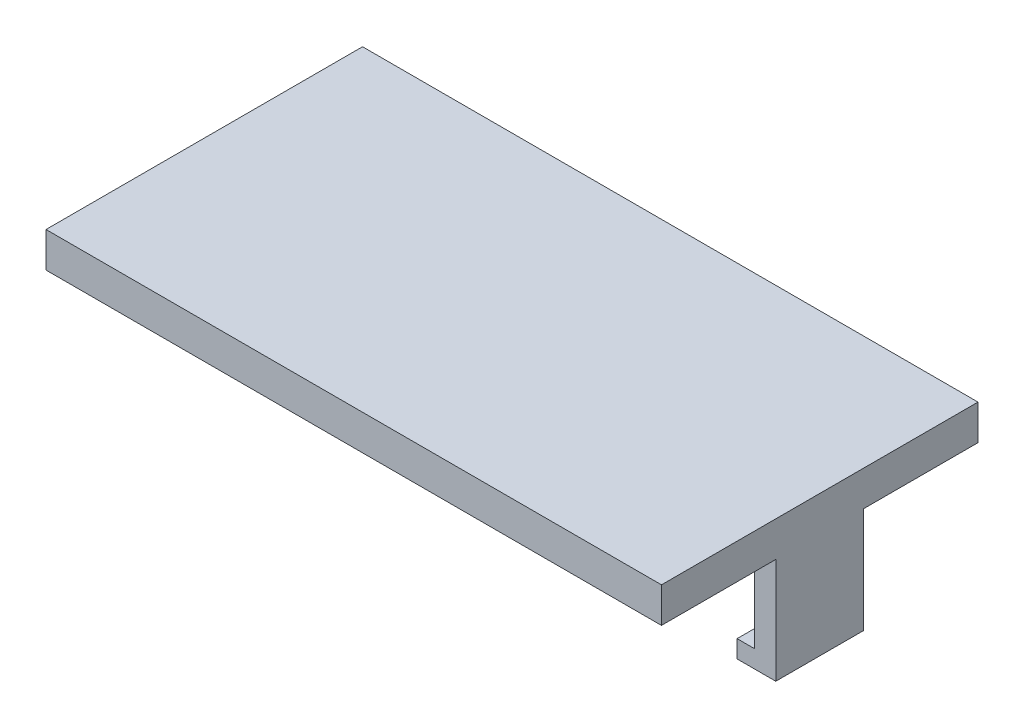
ISO-10303-21;
HEADER;
FILE_DESCRIPTION(('STEP AP214'),'2;1');
FILE_NAME('part.step','',(''),(''),'','','');
FILE_SCHEMA(('AUTOMOTIVE_DESIGN { 1 0 10303 214 1 1 1 1 }'));
ENDSEC;
DATA;
#1=APPLICATION_CONTEXT('core data for automotive mechanical design processes');
#2=APPLICATION_PROTOCOL_DEFINITION('international standard','automotive_design',2000,#1);
#3=PRODUCT_CONTEXT('',#1,'mechanical');
#4=PRODUCT('Part','Part','',(#3));
#5=PRODUCT_RELATED_PRODUCT_CATEGORY('part','',(#4));
#6=PRODUCT_DEFINITION_FORMATION('','',#4);
#7=PRODUCT_DEFINITION_CONTEXT('part definition',#1,'design');
#8=PRODUCT_DEFINITION('design','',#6,#7);
#9=PRODUCT_DEFINITION_SHAPE('','',#8);
#10=(LENGTH_UNIT() NAMED_UNIT(*) SI_UNIT(.MILLI.,.METRE.));
#11=(NAMED_UNIT(*) PLANE_ANGLE_UNIT() SI_UNIT($,.RADIAN.));
#12=(NAMED_UNIT(*) SI_UNIT($,.STERADIAN.) SOLID_ANGLE_UNIT());
#13=UNCERTAINTY_MEASURE_WITH_UNIT(LENGTH_MEASURE(1.E-05),#10,'distance_accuracy_value','');
#14=(GEOMETRIC_REPRESENTATION_CONTEXT(3) GLOBAL_UNCERTAINTY_ASSIGNED_CONTEXT((#13)) GLOBAL_UNIT_ASSIGNED_CONTEXT((#10,
#11,#12)) REPRESENTATION_CONTEXT('',''));
#15=CARTESIAN_POINT('',(0.,0.,0.));
#16=DIRECTION('',(0.,0.,1.));
#17=DIRECTION('',(1.,0.,0.));
#18=AXIS2_PLACEMENT_3D('',#15,#16,#17);
#19=CARTESIAN_POINT('',(16.3,0.,0.));
#20=DIRECTION('',(1.,0.,0.));
#21=DIRECTION('',(0.,0.,-1.));
#22=AXIS2_PLACEMENT_3D('',#19,#20,#21);
#23=PLANE('',#22);
#24=DIRECTION('',(0.,0.,-1.));
#25=VECTOR('',#24,1.);
#26=CARTESIAN_POINT('',(16.3,-5.,-2.5));
#27=LINE('',#26,#25);
#28=CARTESIAN_POINT('',(16.3,-5.,2.5));
#29=VERTEX_POINT('',#28);
#30=CARTESIAN_POINT('',(16.3,-5.,-2.5));
#31=VERTEX_POINT('',#30);
#32=EDGE_CURVE('E211',#29,#31,#27,.T.);
#33=ORIENTED_EDGE('',*,*,#32,.F.);
#34=DIRECTION('',(0.,-1.,0.));
#35=VECTOR('',#34,1.);
#36=CARTESIAN_POINT('',(16.3,0.,2.5));
#37=LINE('',#36,#35);
#38=CARTESIAN_POINT('',(16.3,0.,2.5));
#39=VERTEX_POINT('',#38);
#40=EDGE_CURVE('E259',#39,#29,#37,.T.);
#41=ORIENTED_EDGE('',*,*,#40,.F.);
#42=DIRECTION('',(0.,0.,1.));
#43=VECTOR('',#42,1.);
#44=CARTESIAN_POINT('',(16.3,0.,2.5));
#45=LINE('',#44,#43);
#46=CARTESIAN_POINT('',(16.3,0.,-2.5));
#47=VERTEX_POINT('',#46);
#48=EDGE_CURVE('E254',#47,#39,#45,.T.);
#49=ORIENTED_EDGE('',*,*,#48,.F.);
#50=DIRECTION('',(0.,1.,0.));
#51=VECTOR('',#50,1.);
#52=CARTESIAN_POINT('',(16.3,0.,-2.5));
#53=LINE('',#52,#51);
#54=EDGE_CURVE('E249',#31,#47,#53,.T.);
#55=ORIENTED_EDGE('',*,*,#54,.F.);
#56=EDGE_LOOP('',(#33,#41,#49,#55));
#57=FACE_BOUND('',#56,.T.);
#58=ADVANCED_FACE('F44',(#57),#23,.F.);
#59=CARTESIAN_POINT('',(17.5,2.,9.));
#60=DIRECTION('',(-1.,0.,0.));
#61=DIRECTION('',(0.,0.,1.));
#62=AXIS2_PLACEMENT_3D('',#59,#60,#61);
#63=PLANE('',#62);
#64=DIRECTION('',(0.,0.,-1.));
#65=VECTOR('',#64,1.);
#66=CARTESIAN_POINT('',(17.5,0.,9.));
#67=LINE('',#66,#65);
#68=CARTESIAN_POINT('',(17.5,0.,9.));
#69=VERTEX_POINT('',#68);
#70=CARTESIAN_POINT('',(17.5,0.,2.5));
#71=VERTEX_POINT('',#70);
#72=EDGE_CURVE('E301',#69,#71,#67,.T.);
#73=ORIENTED_EDGE('',*,*,#72,.T.);
#74=DIRECTION('',(0.,-1.,0.));
#75=VECTOR('',#74,1.);
#76=CARTESIAN_POINT('',(17.5,0.,2.5));
#77=LINE('',#76,#75);
#78=CARTESIAN_POINT('',(17.5,-6.,2.5));
#79=VERTEX_POINT('',#78);
#80=EDGE_CURVE('E268',#71,#79,#77,.T.);
#81=ORIENTED_EDGE('',*,*,#80,.T.);
#82=DIRECTION('',(0.,0.,-1.));
#83=VECTOR('',#82,1.);
#84=CARTESIAN_POINT('',(17.5,-6.,2.5));
#85=LINE('',#84,#83);
#86=CARTESIAN_POINT('',(17.5,-6.,-2.5));
#87=VERTEX_POINT('',#86);
#88=EDGE_CURVE('E251',#79,#87,#85,.T.);
#89=ORIENTED_EDGE('',*,*,#88,.T.);
#90=DIRECTION('',(0.,1.,0.));
#91=VECTOR('',#90,1.);
#92=CARTESIAN_POINT('',(17.5,0.,-2.5));
#93=LINE('',#92,#91);
#94=CARTESIAN_POINT('',(17.5,0.,-2.5));
#95=VERTEX_POINT('',#94);
#96=EDGE_CURVE('E248',#87,#95,#93,.T.);
#97=ORIENTED_EDGE('',*,*,#96,.T.);
#98=CARTESIAN_POINT('',(17.5,0.,-9.));
#99=VERTEX_POINT('',#98);
#100=EDGE_CURVE('E277',#95,#99,#67,.T.);
#101=ORIENTED_EDGE('',*,*,#100,.T.);
#102=DIRECTION('',(0.,-1.,0.));
#103=VECTOR('',#102,1.);
#104=CARTESIAN_POINT('',(17.5,2.,-9.));
#105=LINE('',#104,#103);
#106=CARTESIAN_POINT('',(17.5,2.,-9.));
#107=VERTEX_POINT('',#106);
#108=EDGE_CURVE('E11',#107,#99,#105,.T.);
#109=ORIENTED_EDGE('',*,*,#108,.F.);
#110=DIRECTION('',(0.,0.,-1.));
#111=VECTOR('',#110,1.);
#112=CARTESIAN_POINT('',(17.5,2.,9.));
#113=LINE('',#112,#111);
#114=CARTESIAN_POINT('',(17.5,2.,9.));
#115=VERTEX_POINT('',#114);
#116=EDGE_CURVE('E288',#115,#107,#113,.T.);
#117=ORIENTED_EDGE('',*,*,#116,.F.);
#118=DIRECTION('',(0.,-1.,0.));
#119=VECTOR('',#118,1.);
#120=CARTESIAN_POINT('',(17.5,2.,9.));
#121=LINE('',#120,#119);
#122=EDGE_CURVE('E297',#115,#69,#121,.T.);
#123=ORIENTED_EDGE('',*,*,#122,.T.);
#124=EDGE_LOOP('',(#73,#81,#89,#97,#101,#109,#117,#123));
#125=FACE_BOUND('',#124,.T.);
#126=ADVANCED_FACE('F50',(#125),#63,.F.);
#127=CARTESIAN_POINT('',(-17.5,2.,-9.));
#128=DIRECTION('',(0.,0.,1.));
#129=DIRECTION('',(1.,0.,0.));
#130=AXIS2_PLACEMENT_3D('',#127,#128,#129);
#131=PLANE('',#130);
#132=DIRECTION('',(-1.,0.,0.));
#133=VECTOR('',#132,1.);
#134=CARTESIAN_POINT('',(-17.5,0.,-9.));
#135=LINE('',#134,#133);
#136=CARTESIAN_POINT('',(-17.5,0.,-9.));
#137=VERTEX_POINT('',#136);
#138=EDGE_CURVE('E304',#99,#137,#135,.T.);
#139=ORIENTED_EDGE('',*,*,#138,.T.);
#140=DIRECTION('',(0.,-1.,0.));
#141=VECTOR('',#140,1.);
#142=CARTESIAN_POINT('',(-17.5,2.,-9.));
#143=LINE('',#142,#141);
#144=CARTESIAN_POINT('',(-17.5,2.,-9.));
#145=VERTEX_POINT('',#144);
#146=EDGE_CURVE('E53',#145,#137,#143,.T.);
#147=ORIENTED_EDGE('',*,*,#146,.F.);
#148=DIRECTION('',(-1.,0.,0.));
#149=VECTOR('',#148,1.);
#150=CARTESIAN_POINT('',(-17.5,2.,-9.));
#151=LINE('',#150,#149);
#152=EDGE_CURVE('E289',#107,#145,#151,.T.);
#153=ORIENTED_EDGE('',*,*,#152,.F.);
#154=ORIENTED_EDGE('',*,*,#108,.T.);
#155=EDGE_LOOP('',(#139,#147,#153,#154));
#156=FACE_BOUND('',#155,.T.);
#157=ADVANCED_FACE('F390',(#156),#131,.F.);
#158=CARTESIAN_POINT('',(-17.5,2.,9.));
#159=DIRECTION('',(1.,0.,0.));
#160=DIRECTION('',(0.,0.,-1.));
#161=AXIS2_PLACEMENT_3D('',#158,#159,#160);
#162=PLANE('',#161);
#163=DIRECTION('',(0.,0.,1.));
#164=VECTOR('',#163,1.);
#165=CARTESIAN_POINT('',(-17.5,0.,9.));
#166=LINE('',#165,#164);
#167=CARTESIAN_POINT('',(-17.5,0.,-2.5));
#168=VERTEX_POINT('',#167);
#169=EDGE_CURVE('E307',#137,#168,#166,.T.);
#170=ORIENTED_EDGE('',*,*,#169,.T.);
#171=DIRECTION('',(0.,1.,0.));
#172=VECTOR('',#171,1.);
#173=CARTESIAN_POINT('',(-17.5,0.,-2.5));
#174=LINE('',#173,#172);
#175=CARTESIAN_POINT('',(-17.5,-6.,-2.5));
#176=VERTEX_POINT('',#175);
#177=EDGE_CURVE('E164',#176,#168,#174,.T.);
#178=ORIENTED_EDGE('',*,*,#177,.F.);
#179=DIRECTION('',(0.,0.,-1.));
#180=VECTOR('',#179,1.);
#181=CARTESIAN_POINT('',(-17.5,-6.,2.5));
#182=LINE('',#181,#180);
#183=CARTESIAN_POINT('',(-17.5,-6.,2.5));
#184=VERTEX_POINT('',#183);
#185=EDGE_CURVE('E204',#184,#176,#182,.T.);
#186=ORIENTED_EDGE('',*,*,#185,.F.);
#187=DIRECTION('',(0.,-1.,0.));
#188=VECTOR('',#187,1.);
#189=CARTESIAN_POINT('',(-17.5,0.,2.5));
#190=LINE('',#189,#188);
#191=CARTESIAN_POINT('',(-17.5,0.,2.5));
#192=VERTEX_POINT('',#191);
#193=EDGE_CURVE('E193',#192,#184,#190,.T.);
#194=ORIENTED_EDGE('',*,*,#193,.F.);
#195=CARTESIAN_POINT('',(-17.5,0.,9.));
#196=VERTEX_POINT('',#195);
#197=EDGE_CURVE('E308',#192,#196,#166,.T.);
#198=ORIENTED_EDGE('',*,*,#197,.T.);
#199=DIRECTION('',(0.,-1.,0.));
#200=VECTOR('',#199,1.);
#201=CARTESIAN_POINT('',(-17.5,2.,9.));
#202=LINE('',#201,#200);
#203=CARTESIAN_POINT('',(-17.5,2.,9.));
#204=VERTEX_POINT('',#203);
#205=EDGE_CURVE('E319',#204,#196,#202,.T.);
#206=ORIENTED_EDGE('',*,*,#205,.F.);
#207=DIRECTION('',(0.,0.,1.));
#208=VECTOR('',#207,1.);
#209=CARTESIAN_POINT('',(-17.5,2.,9.));
#210=LINE('',#209,#208);
#211=EDGE_CURVE('E295',#145,#204,#210,.T.);
#212=ORIENTED_EDGE('',*,*,#211,.F.);
#213=ORIENTED_EDGE('',*,*,#146,.T.);
#214=EDGE_LOOP('',(#170,#178,#186,#194,#198,#206,#212,#213));
#215=FACE_BOUND('',#214,.T.);
#216=ADVANCED_FACE('F326',(#215),#162,.F.);
#217=CARTESIAN_POINT('',(-17.5,2.,9.));
#218=DIRECTION('',(0.,0.,-1.));
#219=DIRECTION('',(-1.,0.,0.));
#220=AXIS2_PLACEMENT_3D('',#217,#218,#219);
#221=PLANE('',#220);
#222=DIRECTION('',(1.,0.,0.));
#223=VECTOR('',#222,1.);
#224=CARTESIAN_POINT('',(-17.5,0.,9.));
#225=LINE('',#224,#223);
#226=EDGE_CURVE('E293',#196,#69,#225,.T.);
#227=ORIENTED_EDGE('',*,*,#226,.T.);
#228=ORIENTED_EDGE('',*,*,#122,.F.);
#229=DIRECTION('',(1.,0.,0.));
#230=VECTOR('',#229,1.);
#231=CARTESIAN_POINT('',(-17.5,2.,9.));
#232=LINE('',#231,#230);
#233=EDGE_CURVE('E300',#204,#115,#232,.T.);
#234=ORIENTED_EDGE('',*,*,#233,.F.);
#235=ORIENTED_EDGE('',*,*,#205,.T.);
#236=EDGE_LOOP('',(#227,#228,#234,#235));
#237=FACE_BOUND('',#236,.T.);
#238=ADVANCED_FACE('F449',(#237),#221,.F.);
#239=CARTESIAN_POINT('',(0.,2.,0.));
#240=DIRECTION('',(0.,-1.,0.));
#241=DIRECTION('',(0.,0.,-1.));
#242=AXIS2_PLACEMENT_3D('',#239,#240,#241);
#243=PLANE('',#242);
#244=ORIENTED_EDGE('',*,*,#116,.T.);
#245=ORIENTED_EDGE('',*,*,#152,.T.);
#246=ORIENTED_EDGE('',*,*,#211,.T.);
#247=ORIENTED_EDGE('',*,*,#233,.T.);
#248=EDGE_LOOP('',(#244,#245,#246,#247));
#249=FACE_BOUND('',#248,.T.);
#250=ADVANCED_FACE('F437',(#249),#243,.F.);
#251=CARTESIAN_POINT('',(0.,0.,0.));
#252=DIRECTION('',(0.,-1.,0.));
#253=DIRECTION('',(0.,0.,-1.));
#254=AXIS2_PLACEMENT_3D('',#251,#252,#253);
#255=PLANE('',#254);
#256=DIRECTION('',(-1.,0.,0.));
#257=VECTOR('',#256,1.);
#258=CARTESIAN_POINT('',(-16.3,0.,2.5));
#259=LINE('',#258,#257);
#260=CARTESIAN_POINT('',(-16.3,0.,2.5));
#261=VERTEX_POINT('',#260);
#262=EDGE_CURVE('E213',#261,#192,#259,.T.);
#263=ORIENTED_EDGE('',*,*,#262,.F.);
#264=DIRECTION('',(0.,0.,1.));
#265=VECTOR('',#264,1.);
#266=CARTESIAN_POINT('',(-16.3,0.,2.5));
#267=LINE('',#266,#265);
#268=CARTESIAN_POINT('',(-16.3,0.,-2.5));
#269=VERTEX_POINT('',#268);
#270=EDGE_CURVE('E198',#269,#261,#267,.T.);
#271=ORIENTED_EDGE('',*,*,#270,.F.);
#272=DIRECTION('',(-1.,0.,0.));
#273=VECTOR('',#272,1.);
#274=CARTESIAN_POINT('',(-16.3,0.,-2.5));
#275=LINE('',#274,#273);
#276=EDGE_CURVE('E208',#269,#168,#275,.T.);
#277=ORIENTED_EDGE('',*,*,#276,.T.);
#278=ORIENTED_EDGE('',*,*,#169,.F.);
#279=ORIENTED_EDGE('',*,*,#138,.F.);
#280=ORIENTED_EDGE('',*,*,#100,.F.);
#281=DIRECTION('',(1.,0.,0.));
#282=VECTOR('',#281,1.);
#283=CARTESIAN_POINT('',(16.3,0.,-2.5));
#284=LINE('',#283,#282);
#285=EDGE_CURVE('E261',#47,#95,#284,.T.);
#286=ORIENTED_EDGE('',*,*,#285,.F.);
#287=ORIENTED_EDGE('',*,*,#48,.T.);
#288=DIRECTION('',(1.,0.,0.));
#289=VECTOR('',#288,1.);
#290=CARTESIAN_POINT('',(16.3,0.,2.5));
#291=LINE('',#290,#289);
#292=EDGE_CURVE('E278',#39,#71,#291,.T.);
#293=ORIENTED_EDGE('',*,*,#292,.T.);
#294=ORIENTED_EDGE('',*,*,#72,.F.);
#295=ORIENTED_EDGE('',*,*,#226,.F.);
#296=ORIENTED_EDGE('',*,*,#197,.F.);
#297=EDGE_LOOP('',(#263,#271,#277,#278,#279,#280,#286,#287,#293,#294,#295,#296));
#298=FACE_BOUND('',#297,.T.);
#299=ADVANCED_FACE('F332',(#298),#255,.T.);
#300=CARTESIAN_POINT('',(16.3,0.,-2.5));
#301=DIRECTION('',(0.,0.,-1.));
#302=DIRECTION('',(0.,1.,0.));
#303=AXIS2_PLACEMENT_3D('',#300,#301,#302);
#304=PLANE('',#303);
#305=ORIENTED_EDGE('',*,*,#96,.F.);
#306=DIRECTION('',(1.,0.,0.));
#307=VECTOR('',#306,1.);
#308=CARTESIAN_POINT('',(16.3,-6.,-2.5));
#309=LINE('',#308,#307);
#310=CARTESIAN_POINT('',(15.3,-6.,-2.5));
#311=VERTEX_POINT('',#310);
#312=EDGE_CURVE('E271',#311,#87,#309,.T.);
#313=ORIENTED_EDGE('',*,*,#312,.F.);
#314=DIRECTION('',(0.,-1.,0.));
#315=VECTOR('',#314,1.);
#316=CARTESIAN_POINT('',(15.3,-6.,-2.5));
#317=LINE('',#316,#315);
#318=CARTESIAN_POINT('',(15.3,-5.,-2.5));
#319=VERTEX_POINT('',#318);
#320=EDGE_CURVE('E222',#319,#311,#317,.T.);
#321=ORIENTED_EDGE('',*,*,#320,.F.);
#322=DIRECTION('',(1.,0.,0.));
#323=VECTOR('',#322,1.);
#324=CARTESIAN_POINT('',(15.3,-5.,-2.5));
#325=LINE('',#324,#323);
#326=EDGE_CURVE('E238',#319,#31,#325,.T.);
#327=ORIENTED_EDGE('',*,*,#326,.T.);
#328=ORIENTED_EDGE('',*,*,#54,.T.);
#329=ORIENTED_EDGE('',*,*,#285,.T.);
#330=EDGE_LOOP('',(#305,#313,#321,#327,#328,#329));
#331=FACE_BOUND('',#330,.T.);
#332=ADVANCED_FACE('F358',(#331),#304,.T.);
#333=CARTESIAN_POINT('',(16.3,-6.,2.5));
#334=DIRECTION('',(0.,-1.,0.));
#335=DIRECTION('',(0.,0.,-1.));
#336=AXIS2_PLACEMENT_3D('',#333,#334,#335);
#337=PLANE('',#336);
#338=ORIENTED_EDGE('',*,*,#88,.F.);
#339=DIRECTION('',(1.,0.,0.));
#340=VECTOR('',#339,1.);
#341=CARTESIAN_POINT('',(16.3,-6.,2.5));
#342=LINE('',#341,#340);
#343=CARTESIAN_POINT('',(15.3,-6.,2.5));
#344=VERTEX_POINT('',#343);
#345=EDGE_CURVE('E280',#344,#79,#342,.T.);
#346=ORIENTED_EDGE('',*,*,#345,.F.);
#347=DIRECTION('',(0.,0.,1.));
#348=VECTOR('',#347,1.);
#349=CARTESIAN_POINT('',(15.3,-6.,-2.5));
#350=LINE('',#349,#348);
#351=EDGE_CURVE('E226',#311,#344,#350,.T.);
#352=ORIENTED_EDGE('',*,*,#351,.F.);
#353=ORIENTED_EDGE('',*,*,#312,.T.);
#354=EDGE_LOOP('',(#338,#346,#352,#353));
#355=FACE_BOUND('',#354,.T.);
#356=ADVANCED_FACE('F373',(#355),#337,.T.);
#357=CARTESIAN_POINT('',(16.3,0.,2.5));
#358=DIRECTION('',(0.,0.,1.));
#359=DIRECTION('',(0.,-1.,0.));
#360=AXIS2_PLACEMENT_3D('',#357,#358,#359);
#361=PLANE('',#360);
#362=ORIENTED_EDGE('',*,*,#80,.F.);
#363=ORIENTED_EDGE('',*,*,#292,.F.);
#364=ORIENTED_EDGE('',*,*,#40,.T.);
#365=DIRECTION('',(1.,0.,0.));
#366=VECTOR('',#365,1.);
#367=CARTESIAN_POINT('',(15.3,-5.,2.5));
#368=LINE('',#367,#366);
#369=CARTESIAN_POINT('',(15.3,-5.,2.5));
#370=VERTEX_POINT('',#369);
#371=EDGE_CURVE('E244',#370,#29,#368,.T.);
#372=ORIENTED_EDGE('',*,*,#371,.F.);
#373=DIRECTION('',(0.,1.,0.));
#374=VECTOR('',#373,1.);
#375=CARTESIAN_POINT('',(15.3,-6.,2.5));
#376=LINE('',#375,#374);
#377=EDGE_CURVE('E235',#344,#370,#376,.T.);
#378=ORIENTED_EDGE('',*,*,#377,.F.);
#379=ORIENTED_EDGE('',*,*,#345,.T.);
#380=EDGE_LOOP('',(#362,#363,#364,#372,#378,#379));
#381=FACE_BOUND('',#380,.T.);
#382=ADVANCED_FACE('F361',(#381),#361,.T.);
#383=CARTESIAN_POINT('',(15.3,-5.,-2.5));
#384=DIRECTION('',(0.,-1.,0.));
#385=DIRECTION('',(0.,0.,-1.));
#386=AXIS2_PLACEMENT_3D('',#383,#384,#385);
#387=PLANE('',#386);
#388=ORIENTED_EDGE('',*,*,#32,.T.);
#389=ORIENTED_EDGE('',*,*,#326,.F.);
#390=DIRECTION('',(0.,0.,-1.));
#391=VECTOR('',#390,1.);
#392=CARTESIAN_POINT('',(15.3,-5.,-2.5));
#393=LINE('',#392,#391);
#394=EDGE_CURVE('E232',#370,#319,#393,.T.);
#395=ORIENTED_EDGE('',*,*,#394,.F.);
#396=ORIENTED_EDGE('',*,*,#371,.T.);
#397=EDGE_LOOP('',(#388,#389,#395,#396));
#398=FACE_BOUND('',#397,.T.);
#399=ADVANCED_FACE('F370',(#398),#387,.F.);
#400=CARTESIAN_POINT('',(15.3,0.,0.));
#401=DIRECTION('',(1.,0.,0.));
#402=DIRECTION('',(0.,0.,-1.));
#403=AXIS2_PLACEMENT_3D('',#400,#401,#402);
#404=PLANE('',#403);
#405=ORIENTED_EDGE('',*,*,#320,.T.);
#406=ORIENTED_EDGE('',*,*,#351,.T.);
#407=ORIENTED_EDGE('',*,*,#377,.T.);
#408=ORIENTED_EDGE('',*,*,#394,.T.);
#409=EDGE_LOOP('',(#405,#406,#407,#408));
#410=FACE_BOUND('',#409,.T.);
#411=ADVANCED_FACE('F367',(#410),#404,.F.);
#412=CARTESIAN_POINT('',(-16.3,0.,-2.5));
#413=DIRECTION('',(0.,0.,1.));
#414=DIRECTION('',(0.,-1.,0.));
#415=AXIS2_PLACEMENT_3D('',#412,#413,#414);
#416=PLANE('',#415);
#417=ORIENTED_EDGE('',*,*,#177,.T.);
#418=ORIENTED_EDGE('',*,*,#276,.F.);
#419=DIRECTION('',(0.,1.,0.));
#420=VECTOR('',#419,1.);
#421=CARTESIAN_POINT('',(-16.3,0.,-2.5));
#422=LINE('',#421,#420);
#423=CARTESIAN_POINT('',(-16.3,-5.,-2.5));
#424=VERTEX_POINT('',#423);
#425=EDGE_CURVE('E70',#424,#269,#422,.T.);
#426=ORIENTED_EDGE('',*,*,#425,.F.);
#427=DIRECTION('',(-1.,0.,0.));
#428=VECTOR('',#427,1.);
#429=CARTESIAN_POINT('',(-15.3,-5.,-2.5));
#430=LINE('',#429,#428);
#431=CARTESIAN_POINT('',(-15.3,-5.,-2.5));
#432=VERTEX_POINT('',#431);
#433=EDGE_CURVE('E62',#432,#424,#430,.T.);
#434=ORIENTED_EDGE('',*,*,#433,.F.);
#435=DIRECTION('',(0.,-1.,0.));
#436=VECTOR('',#435,1.);
#437=CARTESIAN_POINT('',(-15.3,-6.,-2.5));
#438=LINE('',#437,#436);
#439=CARTESIAN_POINT('',(-15.3,-6.,-2.5));
#440=VERTEX_POINT('',#439);
#441=EDGE_CURVE('E162',#432,#440,#438,.T.);
#442=ORIENTED_EDGE('',*,*,#441,.T.);
#443=DIRECTION('',(-1.,0.,0.));
#444=VECTOR('',#443,1.);
#445=CARTESIAN_POINT('',(-16.3,-6.,-2.5));
#446=LINE('',#445,#444);
#447=EDGE_CURVE('E205',#440,#176,#446,.T.);
#448=ORIENTED_EDGE('',*,*,#447,.T.);
#449=EDGE_LOOP('',(#417,#418,#426,#434,#442,#448));
#450=FACE_BOUND('',#449,.T.);
#451=ADVANCED_FACE('F159',(#450),#416,.F.);
#452=CARTESIAN_POINT('',(-16.3,0.,2.5));
#453=DIRECTION('',(0.,0.,-1.));
#454=DIRECTION('',(0.,1.,0.));
#455=AXIS2_PLACEMENT_3D('',#452,#453,#454);
#456=PLANE('',#455);
#457=ORIENTED_EDGE('',*,*,#193,.T.);
#458=DIRECTION('',(-1.,0.,0.));
#459=VECTOR('',#458,1.);
#460=CARTESIAN_POINT('',(-16.3,-6.,2.5));
#461=LINE('',#460,#459);
#462=CARTESIAN_POINT('',(-15.3,-6.,2.5));
#463=VERTEX_POINT('',#462);
#464=EDGE_CURVE('E220',#463,#184,#461,.T.);
#465=ORIENTED_EDGE('',*,*,#464,.F.);
#466=DIRECTION('',(0.,1.,0.));
#467=VECTOR('',#466,1.);
#468=CARTESIAN_POINT('',(-15.3,-6.,2.5));
#469=LINE('',#468,#467);
#470=CARTESIAN_POINT('',(-15.3,-5.,2.5));
#471=VERTEX_POINT('',#470);
#472=EDGE_CURVE('E181',#463,#471,#469,.T.);
#473=ORIENTED_EDGE('',*,*,#472,.T.);
#474=DIRECTION('',(-1.,0.,0.));
#475=VECTOR('',#474,1.);
#476=CARTESIAN_POINT('',(-15.3,-5.,2.5));
#477=LINE('',#476,#475);
#478=CARTESIAN_POINT('',(-16.3,-5.,2.5));
#479=VERTEX_POINT('',#478);
#480=EDGE_CURVE('E168',#471,#479,#477,.T.);
#481=ORIENTED_EDGE('',*,*,#480,.T.);
#482=DIRECTION('',(0.,-1.,0.));
#483=VECTOR('',#482,1.);
#484=CARTESIAN_POINT('',(-16.3,0.,2.5));
#485=LINE('',#484,#483);
#486=EDGE_CURVE('E191',#261,#479,#485,.T.);
#487=ORIENTED_EDGE('',*,*,#486,.F.);
#488=ORIENTED_EDGE('',*,*,#262,.T.);
#489=EDGE_LOOP('',(#457,#465,#473,#481,#487,#488));
#490=FACE_BOUND('',#489,.T.);
#491=ADVANCED_FACE('F344',(#490),#456,.F.);
#492=CARTESIAN_POINT('',(-16.3,-6.,2.5));
#493=DIRECTION('',(0.,1.,0.));
#494=DIRECTION('',(0.,0.,1.));
#495=AXIS2_PLACEMENT_3D('',#492,#493,#494);
#496=PLANE('',#495);
#497=ORIENTED_EDGE('',*,*,#185,.T.);
#498=ORIENTED_EDGE('',*,*,#447,.F.);
#499=DIRECTION('',(0.,0.,1.));
#500=VECTOR('',#499,1.);
#501=CARTESIAN_POINT('',(-15.3,-6.,-2.5));
#502=LINE('',#501,#500);
#503=EDGE_CURVE('E174',#440,#463,#502,.T.);
#504=ORIENTED_EDGE('',*,*,#503,.T.);
#505=ORIENTED_EDGE('',*,*,#464,.T.);
#506=EDGE_LOOP('',(#497,#498,#504,#505));
#507=FACE_BOUND('',#506,.T.);
#508=ADVANCED_FACE('F342',(#507),#496,.F.);
#509=CARTESIAN_POINT('',(-16.3,0.,0.));
#510=DIRECTION('',(-1.,0.,0.));
#511=DIRECTION('',(0.,0.,-1.));
#512=AXIS2_PLACEMENT_3D('',#509,#510,#511);
#513=PLANE('',#512);
#514=ORIENTED_EDGE('',*,*,#486,.T.);
#515=DIRECTION('',(0.,0.,-1.));
#516=VECTOR('',#515,1.);
#517=CARTESIAN_POINT('',(-16.3,-5.,-2.5));
#518=LINE('',#517,#516);
#519=EDGE_CURVE('E180',#479,#424,#518,.T.);
#520=ORIENTED_EDGE('',*,*,#519,.T.);
#521=ORIENTED_EDGE('',*,*,#425,.T.);
#522=ORIENTED_EDGE('',*,*,#270,.T.);
#523=EDGE_LOOP('',(#514,#520,#521,#522));
#524=FACE_BOUND('',#523,.T.);
#525=ADVANCED_FACE('F400',(#524),#513,.F.);
#526=CARTESIAN_POINT('',(-15.3,-5.,-2.5));
#527=DIRECTION('',(0.,1.,0.));
#528=DIRECTION('',(0.,0.,1.));
#529=AXIS2_PLACEMENT_3D('',#526,#527,#528);
#530=PLANE('',#529);
#531=ORIENTED_EDGE('',*,*,#519,.F.);
#532=ORIENTED_EDGE('',*,*,#480,.F.);
#533=DIRECTION('',(0.,0.,-1.));
#534=VECTOR('',#533,1.);
#535=CARTESIAN_POINT('',(-15.3,-5.,-2.5));
#536=LINE('',#535,#534);
#537=EDGE_CURVE('E175',#471,#432,#536,.T.);
#538=ORIENTED_EDGE('',*,*,#537,.T.);
#539=ORIENTED_EDGE('',*,*,#433,.T.);
#540=EDGE_LOOP('',(#531,#532,#538,#539));
#541=FACE_BOUND('',#540,.T.);
#542=ADVANCED_FACE('F177',(#541),#530,.T.);
#543=CARTESIAN_POINT('',(-15.3,0.,0.));
#544=DIRECTION('',(-1.,0.,0.));
#545=DIRECTION('',(0.,0.,-1.));
#546=AXIS2_PLACEMENT_3D('',#543,#544,#545);
#547=PLANE('',#546);
#548=ORIENTED_EDGE('',*,*,#441,.F.);
#549=ORIENTED_EDGE('',*,*,#537,.F.);
#550=ORIENTED_EDGE('',*,*,#472,.F.);
#551=ORIENTED_EDGE('',*,*,#503,.F.);
#552=EDGE_LOOP('',(#548,#549,#550,#551));
#553=FACE_BOUND('',#552,.T.);
#554=ADVANCED_FACE('F167',(#553),#547,.F.);
#555=CLOSED_SHELL('',(#58,#126,#157,#216,#238,#250,#299,#332,#356,#382,#399,#411,#451,#491,#508,
#525,#542,#554));
#556=MANIFOLD_SOLID_BREP('B2',#555);
#557=ADVANCED_BREP_SHAPE_REPRESENTATION('',(#18,#556),#14);
#558=SHAPE_DEFINITION_REPRESENTATION(#9,#557);
ENDSEC;
END-ISO-10303-21;
